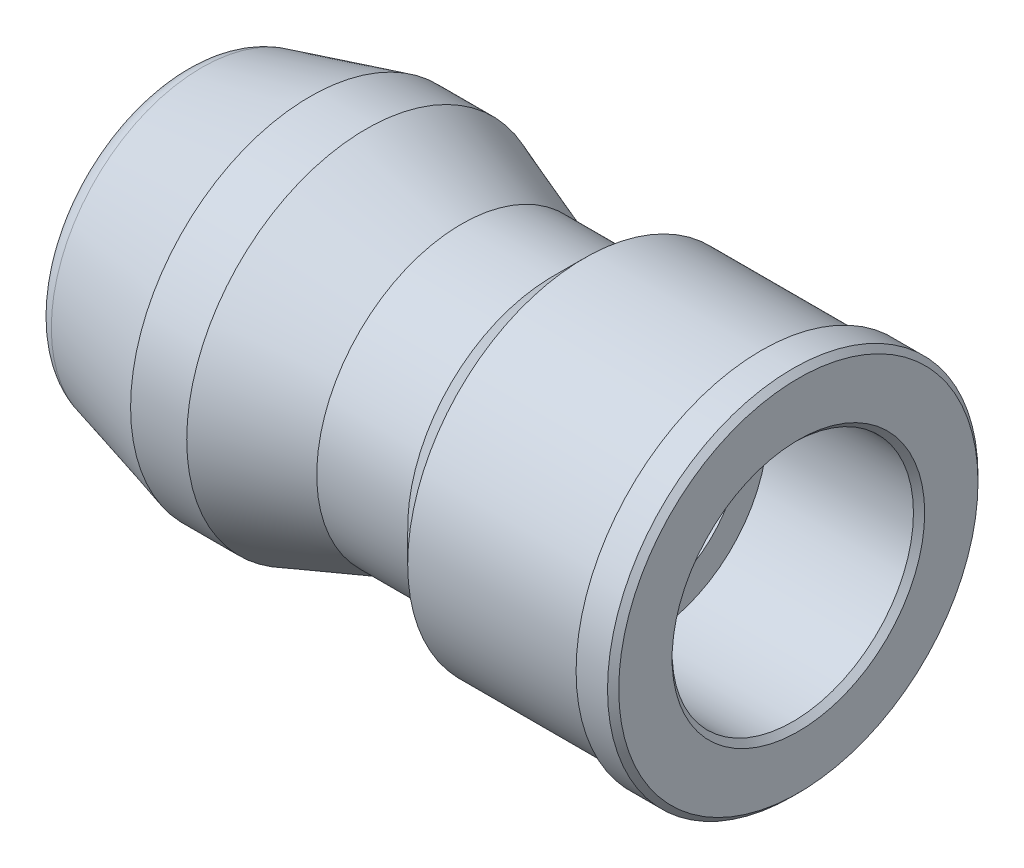
ISO-10303-21;
HEADER;
FILE_DESCRIPTION(('STEP AP214'),'2;1');
FILE_NAME('part.step','',(''),(''),'','','');
FILE_SCHEMA(('AUTOMOTIVE_DESIGN { 1 0 10303 214 1 1 1 1 }'));
ENDSEC;
DATA;
#1=APPLICATION_CONTEXT('core data for automotive mechanical design processes');
#2=APPLICATION_PROTOCOL_DEFINITION('international standard','automotive_design',2000,#1);
#3=PRODUCT_CONTEXT('',#1,'mechanical');
#4=PRODUCT('Part','Part','',(#3));
#5=PRODUCT_RELATED_PRODUCT_CATEGORY('part','',(#4));
#6=PRODUCT_DEFINITION_FORMATION('','',#4);
#7=PRODUCT_DEFINITION_CONTEXT('part definition',#1,'design');
#8=PRODUCT_DEFINITION('design','',#6,#7);
#9=PRODUCT_DEFINITION_SHAPE('','',#8);
#10=(LENGTH_UNIT() NAMED_UNIT(*) SI_UNIT(.MILLI.,.METRE.));
#11=(NAMED_UNIT(*) PLANE_ANGLE_UNIT() SI_UNIT($,.RADIAN.));
#12=(NAMED_UNIT(*) SI_UNIT($,.STERADIAN.) SOLID_ANGLE_UNIT());
#13=UNCERTAINTY_MEASURE_WITH_UNIT(LENGTH_MEASURE(1.E-05),#10,'distance_accuracy_value','');
#14=(GEOMETRIC_REPRESENTATION_CONTEXT(3) GLOBAL_UNCERTAINTY_ASSIGNED_CONTEXT((#13)) GLOBAL_UNIT_ASSIGNED_CONTEXT((#10,
#11,#12)) REPRESENTATION_CONTEXT('',''));
#15=CARTESIAN_POINT('',(0.,0.,0.));
#16=DIRECTION('',(0.,0.,1.));
#17=DIRECTION('',(1.,0.,0.));
#18=AXIS2_PLACEMENT_3D('',#15,#16,#17);
#19=CARTESIAN_POINT('',(8.3,2.15,0.));
#20=DIRECTION('',(1.,0.,0.));
#21=DIRECTION('',(0.,0.,-1.));
#22=AXIS2_PLACEMENT_3D('',#19,#20,#21);
#23=PLANE('',#22);
#24=CARTESIAN_POINT('',(8.3,0.,0.));
#25=DIRECTION('',(1.,0.,0.));
#26=DIRECTION('',(0.,0.,-1.));
#27=AXIS2_PLACEMENT_3D('',#24,#25,#26);
#28=CIRCLE('',#27,1.65);
#29=CARTESIAN_POINT('',(8.3,0.,-1.65));
#30=VERTEX_POINT('',#29);
#31=EDGE_CURVE('E81',#30,#30,#28,.T.);
#32=ORIENTED_EDGE('',*,*,#31,.F.);
#33=EDGE_LOOP('',(#32));
#34=FACE_BOUND('',#33,.T.);
#35=CARTESIAN_POINT('',(8.3,0.,0.));
#36=DIRECTION('',(1.,0.,0.));
#37=DIRECTION('',(0.,0.,-1.));
#38=AXIS2_PLACEMENT_3D('',#35,#36,#37);
#39=CIRCLE('',#38,2.15);
#40=CARTESIAN_POINT('',(8.3,0.,-2.15));
#41=VERTEX_POINT('',#40);
#42=EDGE_CURVE('E84',#41,#41,#39,.T.);
#43=ORIENTED_EDGE('',*,*,#42,.T.);
#44=EDGE_LOOP('',(#43));
#45=FACE_BOUND('',#44,.T.);
#46=ADVANCED_FACE('F47',(#34,#45),#23,.T.);
#47=CARTESIAN_POINT('',(0.,0.,0.));
#48=DIRECTION('',(-1.,0.,0.));
#49=DIRECTION('',(0.,0.,1.));
#50=AXIS2_PLACEMENT_3D('',#47,#48,#49);
#51=PLANE('',#50);
#52=CARTESIAN_POINT('',(0.,0.,0.));
#53=DIRECTION('',(-1.,0.,0.));
#54=DIRECTION('',(0.,0.,1.));
#55=AXIS2_PLACEMENT_3D('',#52,#53,#54);
#56=CIRCLE('',#55,2.19633650601052);
#57=CARTESIAN_POINT('',(0.,0.,2.19633650601052));
#58=VERTEX_POINT('',#57);
#59=EDGE_CURVE('E74',#58,#58,#56,.T.);
#60=ORIENTED_EDGE('',*,*,#59,.T.);
#61=EDGE_LOOP('',(#60));
#62=FACE_BOUND('',#61,.T.);
#63=CARTESIAN_POINT('',(0.,0.,0.));
#64=DIRECTION('',(-1.,0.,0.));
#65=DIRECTION('',(0.,0.,1.));
#66=AXIS2_PLACEMENT_3D('',#63,#64,#65);
#67=CIRCLE('',#66,2.025);
#68=CARTESIAN_POINT('',(0.,0.,2.025));
#69=VERTEX_POINT('',#68);
#70=EDGE_CURVE('E107',#69,#69,#67,.T.);
#71=ORIENTED_EDGE('',*,*,#70,.F.);
#72=EDGE_LOOP('',(#71));
#73=FACE_BOUND('',#72,.T.);
#74=ADVANCED_FACE('F113',(#62,#73),#51,.T.);
#75=CARTESIAN_POINT('',(2.3,0.,0.));
#76=DIRECTION('',(1.,0.,0.));
#77=DIRECTION('',(0.,0.,-1.));
#78=AXIS2_PLACEMENT_3D('',#75,#76,#77);
#79=CONICAL_SURFACE('',#78,3.19628314259158,0.261799387799146);
#80=CARTESIAN_POINT('',(0.370590477448743,0.,0.));
#81=DIRECTION('',(-1.,0.,0.));
#82=DIRECTION('',(0.,0.,1.));
#83=AXIS2_PLACEMENT_3D('',#80,#81,#82);
#84=CIRCLE('',#83,2.67929941915505);
#85=CARTESIAN_POINT('',(0.370590477448743,0.,2.67929941915505));
#86=VERTEX_POINT('',#85);
#87=EDGE_CURVE('E77',#86,#86,#84,.F.);
#88=ORIENTED_EDGE('',*,*,#87,.T.);
#89=EDGE_LOOP('',(#88));
#90=FACE_BOUND('',#89,.T.);
#91=CARTESIAN_POINT('',(2.3,0.,0.));
#92=DIRECTION('',(1.,0.,0.));
#93=DIRECTION('',(0.,0.,-1.));
#94=AXIS2_PLACEMENT_3D('',#91,#92,#93);
#95=CIRCLE('',#94,3.19628314259158);
#96=CARTESIAN_POINT('',(2.3,0.,-3.19628314259158));
#97=VERTEX_POINT('',#96);
#98=EDGE_CURVE('E80',#97,#97,#95,.T.);
#99=ORIENTED_EDGE('',*,*,#98,.F.);
#100=EDGE_LOOP('',(#99));
#101=FACE_BOUND('',#100,.T.);
#102=ADVANCED_FACE('F115',(#90,#101),#79,.T.);
#103=CARTESIAN_POINT('',(5.88959012533123,0.,0.));
#104=DIRECTION('',(1.,0.,0.));
#105=DIRECTION('',(0.,0.,-1.));
#106=AXIS2_PLACEMENT_3D('',#103,#104,#105);
#107=CYLINDRICAL_SURFACE('',#106,3.19628314259158);
#108=ORIENTED_EDGE('',*,*,#98,.T.);
#109=EDGE_LOOP('',(#108));
#110=FACE_BOUND('',#109,.T.);
#111=CARTESIAN_POINT('',(3.3,0.,0.));
#112=DIRECTION('',(1.,0.,0.));
#113=DIRECTION('',(0.,0.,-1.));
#114=AXIS2_PLACEMENT_3D('',#111,#112,#113);
#115=CIRCLE('',#114,3.19628314259158);
#116=CARTESIAN_POINT('',(3.3,0.,-3.19628314259158));
#117=VERTEX_POINT('',#116);
#118=EDGE_CURVE('E88',#117,#117,#115,.T.);
#119=ORIENTED_EDGE('',*,*,#118,.F.);
#120=EDGE_LOOP('',(#119));
#121=FACE_BOUND('',#120,.T.);
#122=ADVANCED_FACE('F122',(#110,#121),#107,.T.);
#123=CARTESIAN_POINT('',(5.,0.,0.));
#124=DIRECTION('',(-1.,0.,0.));
#125=DIRECTION('',(0.,0.,1.));
#126=AXIS2_PLACEMENT_3D('',#123,#124,#125);
#127=CONICAL_SURFACE('',#126,2.58,0.347784219086138);
#128=ORIENTED_EDGE('',*,*,#118,.T.);
#129=EDGE_LOOP('',(#128));
#130=FACE_BOUND('',#129,.T.);
#131=CARTESIAN_POINT('',(5.,0.,0.));
#132=DIRECTION('',(1.,0.,0.));
#133=DIRECTION('',(0.,0.,-1.));
#134=AXIS2_PLACEMENT_3D('',#131,#132,#133);
#135=CIRCLE('',#134,2.58);
#136=CARTESIAN_POINT('',(5.,0.,-2.58));
#137=VERTEX_POINT('',#136);
#138=EDGE_CURVE('E91',#137,#137,#135,.T.);
#139=ORIENTED_EDGE('',*,*,#138,.F.);
#140=EDGE_LOOP('',(#139));
#141=FACE_BOUND('',#140,.T.);
#142=ADVANCED_FACE('F184',(#130,#141),#127,.T.);
#143=CARTESIAN_POINT('',(5.88959012533123,0.,0.));
#144=DIRECTION('',(1.,0.,0.));
#145=DIRECTION('',(0.,0.,-1.));
#146=AXIS2_PLACEMENT_3D('',#143,#144,#145);
#147=CYLINDRICAL_SURFACE('',#146,2.58);
#148=ORIENTED_EDGE('',*,*,#138,.T.);
#149=EDGE_LOOP('',(#148));
#150=FACE_BOUND('',#149,.T.);
#151=CARTESIAN_POINT('',(6.62,0.,0.));
#152=DIRECTION('',(1.,0.,0.));
#153=DIRECTION('',(0.,0.,-1.));
#154=AXIS2_PLACEMENT_3D('',#151,#152,#153);
#155=CIRCLE('',#154,2.58);
#156=CARTESIAN_POINT('',(6.62,0.,-2.58));
#157=VERTEX_POINT('',#156);
#158=EDGE_CURVE('E94',#157,#157,#155,.T.);
#159=ORIENTED_EDGE('',*,*,#158,.F.);
#160=EDGE_LOOP('',(#159));
#161=FACE_BOUND('',#160,.T.);
#162=ADVANCED_FACE('F180',(#150,#161),#147,.T.);
#163=CARTESIAN_POINT('',(7.19,0.,0.));
#164=DIRECTION('',(1.,0.,0.));
#165=DIRECTION('',(0.,0.,-1.));
#166=AXIS2_PLACEMENT_3D('',#163,#164,#165);
#167=CONICAL_SURFACE('',#166,3.15,0.78539816339745);
#168=ORIENTED_EDGE('',*,*,#158,.T.);
#169=EDGE_LOOP('',(#168));
#170=FACE_BOUND('',#169,.T.);
#171=CARTESIAN_POINT('',(7.19,0.,0.));
#172=DIRECTION('',(1.,0.,0.));
#173=DIRECTION('',(0.,0.,-1.));
#174=AXIS2_PLACEMENT_3D('',#171,#172,#173);
#175=CIRCLE('',#174,3.15);
#176=CARTESIAN_POINT('',(7.19,0.,-3.15));
#177=VERTEX_POINT('',#176);
#178=EDGE_CURVE('E97',#177,#177,#175,.T.);
#179=ORIENTED_EDGE('',*,*,#178,.F.);
#180=EDGE_LOOP('',(#179));
#181=FACE_BOUND('',#180,.T.);
#182=ADVANCED_FACE('F177',(#170,#181),#167,.T.);
#183=CARTESIAN_POINT('',(5.88959012533123,0.,0.));
#184=DIRECTION('',(1.,0.,0.));
#185=DIRECTION('',(0.,0.,-1.));
#186=AXIS2_PLACEMENT_3D('',#183,#184,#185);
#187=CYLINDRICAL_SURFACE('',#186,3.15);
#188=CARTESIAN_POINT('',(10.24,0.,0.));
#189=DIRECTION('',(-1.,0.,0.));
#190=DIRECTION('',(0.,0.,1.));
#191=AXIS2_PLACEMENT_3D('',#188,#189,#190);
#192=CIRCLE('',#191,3.15);
#193=CARTESIAN_POINT('',(10.24,0.,3.15));
#194=VERTEX_POINT('',#193);
#195=EDGE_CURVE('E10',#194,#194,#192,.T.);
#196=ORIENTED_EDGE('',*,*,#195,.T.);
#197=EDGE_LOOP('',(#196));
#198=FACE_BOUND('',#197,.T.);
#199=ORIENTED_EDGE('',*,*,#178,.T.);
#200=EDGE_LOOP('',(#199));
#201=FACE_BOUND('',#200,.T.);
#202=ADVANCED_FACE('F174',(#198,#201),#187,.T.);
#203=CARTESIAN_POINT('',(10.34,3.15,0.));
#204=DIRECTION('',(-1.,0.,0.));
#205=DIRECTION('',(0.,0.,1.));
#206=AXIS2_PLACEMENT_3D('',#203,#204,#205);
#207=PLANE('',#206);
#208=CARTESIAN_POINT('',(10.34,0.,0.));
#209=DIRECTION('',(-1.,0.,0.));
#210=DIRECTION('',(0.,0.,1.));
#211=AXIS2_PLACEMENT_3D('',#208,#209,#210);
#212=CIRCLE('',#211,3.25);
#213=CARTESIAN_POINT('',(10.34,0.,3.25));
#214=VERTEX_POINT('',#213);
#215=EDGE_CURVE('E55',#214,#214,#212,.F.);
#216=ORIENTED_EDGE('',*,*,#215,.T.);
#217=EDGE_LOOP('',(#216));
#218=FACE_BOUND('',#217,.T.);
#219=CARTESIAN_POINT('',(10.34,0.,0.));
#220=DIRECTION('',(1.,0.,0.));
#221=DIRECTION('',(0.,0.,-1.));
#222=AXIS2_PLACEMENT_3D('',#219,#220,#221);
#223=CIRCLE('',#222,3.3);
#224=CARTESIAN_POINT('',(10.34,0.,-3.3));
#225=VERTEX_POINT('',#224);
#226=EDGE_CURVE('E100',#225,#225,#223,.T.);
#227=ORIENTED_EDGE('',*,*,#226,.F.);
#228=EDGE_LOOP('',(#227));
#229=FACE_BOUND('',#228,.T.);
#230=ADVANCED_FACE('F167',(#218,#229),#207,.T.);
#231=CARTESIAN_POINT('',(5.88959012533123,0.,0.));
#232=DIRECTION('',(1.,0.,0.));
#233=DIRECTION('',(0.,0.,-1.));
#234=AXIS2_PLACEMENT_3D('',#231,#232,#233);
#235=CYLINDRICAL_SURFACE('',#234,3.3);
#236=CARTESIAN_POINT('',(10.9,0.,0.));
#237=DIRECTION('',(1.,0.,0.));
#238=DIRECTION('',(0.,0.,-1.));
#239=AXIS2_PLACEMENT_3D('',#236,#237,#238);
#240=CIRCLE('',#239,3.3);
#241=CARTESIAN_POINT('',(10.9,0.,-3.3));
#242=VERTEX_POINT('',#241);
#243=EDGE_CURVE('E59',#242,#242,#240,.F.);
#244=ORIENTED_EDGE('',*,*,#243,.T.);
#245=EDGE_LOOP('',(#244));
#246=FACE_BOUND('',#245,.T.);
#247=ORIENTED_EDGE('',*,*,#226,.T.);
#248=EDGE_LOOP('',(#247));
#249=FACE_BOUND('',#248,.T.);
#250=ADVANCED_FACE('F157',(#246,#249),#235,.T.);
#251=CARTESIAN_POINT('',(11.,3.3,0.));
#252=DIRECTION('',(1.,0.,0.));
#253=DIRECTION('',(0.,0.,-1.));
#254=AXIS2_PLACEMENT_3D('',#251,#252,#253);
#255=PLANE('',#254);
#256=CARTESIAN_POINT('',(11.,0.,0.));
#257=DIRECTION('',(1.,0.,0.));
#258=DIRECTION('',(0.,0.,-1.));
#259=AXIS2_PLACEMENT_3D('',#256,#257,#258);
#260=CIRCLE('',#259,2.25000000000001);
#261=CARTESIAN_POINT('',(11.,0.,-2.25000000000001));
#262=VERTEX_POINT('',#261);
#263=EDGE_CURVE('E63',#262,#262,#260,.F.);
#264=ORIENTED_EDGE('',*,*,#263,.T.);
#265=EDGE_LOOP('',(#264));
#266=FACE_BOUND('',#265,.T.);
#267=CARTESIAN_POINT('',(11.,0.,0.));
#268=DIRECTION('',(1.,0.,0.));
#269=DIRECTION('',(0.,0.,-1.));
#270=AXIS2_PLACEMENT_3D('',#267,#268,#269);
#271=CIRCLE('',#270,3.20000000000001);
#272=CARTESIAN_POINT('',(11.,0.,-3.20000000000001));
#273=VERTEX_POINT('',#272);
#274=EDGE_CURVE('E68',#273,#273,#271,.T.);
#275=ORIENTED_EDGE('',*,*,#274,.T.);
#276=EDGE_LOOP('',(#275));
#277=FACE_BOUND('',#276,.T.);
#278=ADVANCED_FACE('F154',(#266,#277),#255,.T.);
#279=CARTESIAN_POINT('',(5.88959012533123,0.,0.));
#280=DIRECTION('',(1.,0.,0.));
#281=DIRECTION('',(0.,0.,-1.));
#282=AXIS2_PLACEMENT_3D('',#279,#280,#281);
#283=CYLINDRICAL_SURFACE('',#282,2.15);
#284=CARTESIAN_POINT('',(10.9,0.,0.));
#285=DIRECTION('',(1.,0.,0.));
#286=DIRECTION('',(0.,0.,-1.));
#287=AXIS2_PLACEMENT_3D('',#284,#285,#286);
#288=CIRCLE('',#287,2.15);
#289=CARTESIAN_POINT('',(10.9,0.,-2.15));
#290=VERTEX_POINT('',#289);
#291=EDGE_CURVE('E71',#290,#290,#288,.T.);
#292=ORIENTED_EDGE('',*,*,#291,.T.);
#293=EDGE_LOOP('',(#292));
#294=FACE_BOUND('',#293,.T.);
#295=ORIENTED_EDGE('',*,*,#42,.F.);
#296=EDGE_LOOP('',(#295));
#297=FACE_BOUND('',#296,.T.);
#298=ADVANCED_FACE('F156',(#294,#297),#283,.F.);
#299=CARTESIAN_POINT('',(0.,0.,0.));
#300=DIRECTION('',(-1.,0.,0.));
#301=DIRECTION('',(0.,0.,1.));
#302=AXIS2_PLACEMENT_3D('',#299,#300,#301);
#303=CYLINDRICAL_SURFACE('',#302,1.65);
#304=ORIENTED_EDGE('',*,*,#31,.T.);
#305=EDGE_LOOP('',(#304));
#306=FACE_BOUND('',#305,.T.);
#307=CARTESIAN_POINT('',(0.905330085889919,0.,0.));
#308=DIRECTION('',(-1.,0.,0.));
#309=DIRECTION('',(0.,0.,1.));
#310=AXIS2_PLACEMENT_3D('',#307,#308,#309);
#311=CIRCLE('',#310,1.65);
#312=CARTESIAN_POINT('',(0.905330085889919,0.,1.65));
#313=VERTEX_POINT('',#312);
#314=EDGE_CURVE('E85',#313,#313,#311,.T.);
#315=ORIENTED_EDGE('',*,*,#314,.T.);
#316=EDGE_LOOP('',(#315));
#317=FACE_BOUND('',#316,.T.);
#318=ADVANCED_FACE('F164',(#306,#317),#303,.F.);
#319=CARTESIAN_POINT('',(0.,0.,0.));
#320=DIRECTION('',(-1.,0.,0.));
#321=DIRECTION('',(0.,0.,1.));
#322=AXIS2_PLACEMENT_3D('',#319,#320,#321);
#323=CONICAL_SURFACE('',#322,2.025,0.392699081698721);
#324=ORIENTED_EDGE('',*,*,#314,.F.);
#325=EDGE_LOOP('',(#324));
#326=FACE_BOUND('',#325,.T.);
#327=ORIENTED_EDGE('',*,*,#70,.T.);
#328=EDGE_LOOP('',(#327));
#329=FACE_BOUND('',#328,.T.);
#330=ADVANCED_FACE('F111',(#326,#329),#323,.F.);
#331=CARTESIAN_POINT('',(0.5,0.,0.));
#332=DIRECTION('',(-1.,0.,0.));
#333=DIRECTION('',(0.,0.,1.));
#334=AXIS2_PLACEMENT_3D('',#331,#332,#333);
#335=TOROIDAL_SURFACE('',#334,2.19633650601052,0.5);
#336=ORIENTED_EDGE('',*,*,#59,.F.);
#337=EDGE_LOOP('',(#336));
#338=FACE_BOUND('',#337,.T.);
#339=ORIENTED_EDGE('',*,*,#87,.F.);
#340=EDGE_LOOP('',(#339));
#341=FACE_BOUND('',#340,.T.);
#342=ADVANCED_FACE('F130',(#338,#341),#335,.T.);
#343=CARTESIAN_POINT('',(10.9,0.,0.));
#344=DIRECTION('',(1.,0.,0.));
#345=DIRECTION('',(0.,0.,-1.));
#346=AXIS2_PLACEMENT_3D('',#343,#344,#345);
#347=CONICAL_SURFACE('',#346,2.15,0.78539816339744);
#348=ORIENTED_EDGE('',*,*,#263,.F.);
#349=EDGE_LOOP('',(#348));
#350=FACE_BOUND('',#349,.T.);
#351=ORIENTED_EDGE('',*,*,#291,.F.);
#352=EDGE_LOOP('',(#351));
#353=FACE_BOUND('',#352,.T.);
#354=ADVANCED_FACE('F133',(#350,#353),#347,.F.);
#355=CARTESIAN_POINT('',(11.,0.,0.));
#356=DIRECTION('',(-1.,0.,0.));
#357=DIRECTION('',(0.,0.,1.));
#358=AXIS2_PLACEMENT_3D('',#355,#356,#357);
#359=CONICAL_SURFACE('',#358,3.20000000000001,0.78539816339744);
#360=ORIENTED_EDGE('',*,*,#243,.F.);
#361=EDGE_LOOP('',(#360));
#362=FACE_BOUND('',#361,.T.);
#363=ORIENTED_EDGE('',*,*,#274,.F.);
#364=EDGE_LOOP('',(#363));
#365=FACE_BOUND('',#364,.T.);
#366=ADVANCED_FACE('F140',(#362,#365),#359,.T.);
#367=CARTESIAN_POINT('',(10.34,0.,0.));
#368=DIRECTION('',(1.,0.,0.));
#369=DIRECTION('',(0.,0.,-1.));
#370=AXIS2_PLACEMENT_3D('',#367,#368,#369);
#371=CONICAL_SURFACE('',#370,3.25,0.785398163397455);
#372=ORIENTED_EDGE('',*,*,#195,.F.);
#373=EDGE_LOOP('',(#372));
#374=FACE_BOUND('',#373,.T.);
#375=ORIENTED_EDGE('',*,*,#215,.F.);
#376=EDGE_LOOP('',(#375));
#377=FACE_BOUND('',#376,.T.);
#378=ADVANCED_FACE('F50',(#374,#377),#371,.T.);
#379=CLOSED_SHELL('',(#46,#74,#102,#122,#142,#162,#182,#202,#230,#250,#278,#298,#318,#330,#342,
#354,#366,#378));
#380=MANIFOLD_SOLID_BREP('B2',#379);
#381=ADVANCED_BREP_SHAPE_REPRESENTATION('',(#18,#380),#14);
#382=SHAPE_DEFINITION_REPRESENTATION(#9,#381);
ENDSEC;
END-ISO-10303-21;
